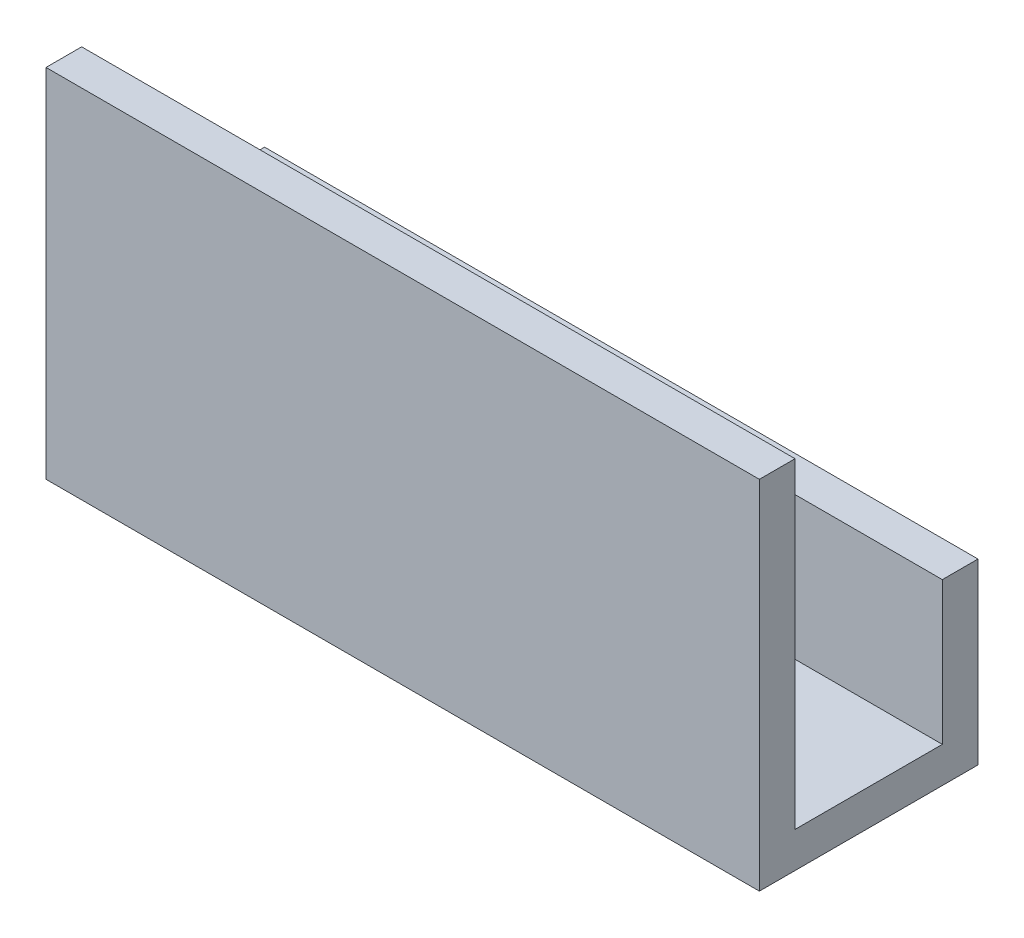
ISO-10303-21;
HEADER;
FILE_DESCRIPTION(('STEP AP214'),'2;1');
FILE_NAME('part.step','',(''),(''),'','','');
FILE_SCHEMA(('AUTOMOTIVE_DESIGN { 1 0 10303 214 1 1 1 1 }'));
ENDSEC;
DATA;
#1=APPLICATION_CONTEXT('core data for automotive mechanical design processes');
#2=APPLICATION_PROTOCOL_DEFINITION('international standard','automotive_design',2000,#1);
#3=PRODUCT_CONTEXT('',#1,'mechanical');
#4=PRODUCT('Part','Part','',(#3));
#5=PRODUCT_RELATED_PRODUCT_CATEGORY('part','',(#4));
#6=PRODUCT_DEFINITION_FORMATION('','',#4);
#7=PRODUCT_DEFINITION_CONTEXT('part definition',#1,'design');
#8=PRODUCT_DEFINITION('design','',#6,#7);
#9=PRODUCT_DEFINITION_SHAPE('','',#8);
#10=(LENGTH_UNIT() NAMED_UNIT(*) SI_UNIT(.MILLI.,.METRE.));
#11=(NAMED_UNIT(*) PLANE_ANGLE_UNIT() SI_UNIT($,.RADIAN.));
#12=(NAMED_UNIT(*) SI_UNIT($,.STERADIAN.) SOLID_ANGLE_UNIT());
#13=UNCERTAINTY_MEASURE_WITH_UNIT(LENGTH_MEASURE(1.E-05),#10,'distance_accuracy_value','');
#14=(GEOMETRIC_REPRESENTATION_CONTEXT(3) GLOBAL_UNCERTAINTY_ASSIGNED_CONTEXT((#13)) GLOBAL_UNIT_ASSIGNED_CONTEXT((#10,
#11,#12)) REPRESENTATION_CONTEXT('',''));
#15=CARTESIAN_POINT('',(0.,0.,0.));
#16=DIRECTION('',(0.,0.,1.));
#17=DIRECTION('',(1.,0.,0.));
#18=AXIS2_PLACEMENT_3D('',#15,#16,#17);
#19=CARTESIAN_POINT('',(25.4,0.,-7.78383));
#20=DIRECTION('',(0.,0.,1.));
#21=DIRECTION('',(1.,0.,0.));
#22=AXIS2_PLACEMENT_3D('',#19,#20,#21);
#23=PLANE('',#22);
#24=DIRECTION('',(0.,1.,0.));
#25=VECTOR('',#24,1.);
#26=CARTESIAN_POINT('',(-25.4,0.,-7.78383));
#27=LINE('',#26,#25);
#28=CARTESIAN_POINT('',(-25.4,0.,-7.78383));
#29=VERTEX_POINT('',#28);
#30=CARTESIAN_POINT('',(-25.4,12.7,-7.78383));
#31=VERTEX_POINT('',#30);
#32=EDGE_CURVE('E133',#29,#31,#27,.T.);
#33=ORIENTED_EDGE('',*,*,#32,.T.);
#34=DIRECTION('',(-1.,0.,0.));
#35=VECTOR('',#34,1.);
#36=CARTESIAN_POINT('',(25.4,12.7,-7.78383));
#37=LINE('',#36,#35);
#38=CARTESIAN_POINT('',(25.4,12.7,-7.78383));
#39=VERTEX_POINT('',#38);
#40=EDGE_CURVE('E11',#39,#31,#37,.T.);
#41=ORIENTED_EDGE('',*,*,#40,.F.);
#42=DIRECTION('',(0.,1.,0.));
#43=VECTOR('',#42,1.);
#44=CARTESIAN_POINT('',(25.4,0.,-7.78383));
#45=LINE('',#44,#43);
#46=CARTESIAN_POINT('',(25.4,0.,-7.78383));
#47=VERTEX_POINT('',#46);
#48=EDGE_CURVE('E147',#47,#39,#45,.T.);
#49=ORIENTED_EDGE('',*,*,#48,.F.);
#50=DIRECTION('',(-1.,0.,0.));
#51=VECTOR('',#50,1.);
#52=CARTESIAN_POINT('',(25.4,0.,-7.78383));
#53=LINE('',#52,#51);
#54=EDGE_CURVE('E129',#47,#29,#53,.T.);
#55=ORIENTED_EDGE('',*,*,#54,.T.);
#56=EDGE_LOOP('',(#33,#41,#49,#55));
#57=FACE_BOUND('',#56,.T.);
#58=ADVANCED_FACE('F37',(#57),#23,.F.);
#59=CARTESIAN_POINT('',(25.4,12.7,-5.24383));
#60=DIRECTION('',(0.,-1.,0.));
#61=DIRECTION('',(0.,0.,-1.));
#62=AXIS2_PLACEMENT_3D('',#59,#60,#61);
#63=PLANE('',#62);
#64=DIRECTION('',(0.,0.,1.));
#65=VECTOR('',#64,1.);
#66=CARTESIAN_POINT('',(-25.4,12.7,-5.24383));
#67=LINE('',#66,#65);
#68=CARTESIAN_POINT('',(-25.4,12.7,-5.24383));
#69=VERTEX_POINT('',#68);
#70=EDGE_CURVE('E136',#31,#69,#67,.T.);
#71=ORIENTED_EDGE('',*,*,#70,.T.);
#72=DIRECTION('',(-1.,0.,0.));
#73=VECTOR('',#72,1.);
#74=CARTESIAN_POINT('',(25.4,12.7,-5.24383));
#75=LINE('',#74,#73);
#76=CARTESIAN_POINT('',(25.4,12.7,-5.24383));
#77=VERTEX_POINT('',#76);
#78=EDGE_CURVE('E45',#77,#69,#75,.T.);
#79=ORIENTED_EDGE('',*,*,#78,.F.);
#80=DIRECTION('',(0.,0.,1.));
#81=VECTOR('',#80,1.);
#82=CARTESIAN_POINT('',(25.4,12.7,-5.24383));
#83=LINE('',#82,#81);
#84=EDGE_CURVE('E96',#39,#77,#83,.T.);
#85=ORIENTED_EDGE('',*,*,#84,.F.);
#86=ORIENTED_EDGE('',*,*,#40,.T.);
#87=EDGE_LOOP('',(#71,#79,#85,#86));
#88=FACE_BOUND('',#87,.T.);
#89=ADVANCED_FACE('F182',(#88),#63,.F.);
#90=CARTESIAN_POINT('',(25.4,2.54,-5.24383));
#91=DIRECTION('',(0.,0.,-1.));
#92=DIRECTION('',(-1.,0.,0.));
#93=AXIS2_PLACEMENT_3D('',#90,#91,#92);
#94=PLANE('',#93);
#95=DIRECTION('',(0.,-1.,0.));
#96=VECTOR('',#95,1.);
#97=CARTESIAN_POINT('',(-25.4,2.54,-5.24383));
#98=LINE('',#97,#96);
#99=CARTESIAN_POINT('',(-25.4,2.54,-5.24383));
#100=VERTEX_POINT('',#99);
#101=EDGE_CURVE('E138',#69,#100,#98,.T.);
#102=ORIENTED_EDGE('',*,*,#101,.T.);
#103=DIRECTION('',(-1.,0.,0.));
#104=VECTOR('',#103,1.);
#105=CARTESIAN_POINT('',(25.4,2.54,-5.24383));
#106=LINE('',#105,#104);
#107=CARTESIAN_POINT('',(25.4,2.54,-5.24383));
#108=VERTEX_POINT('',#107);
#109=EDGE_CURVE('E154',#108,#100,#106,.T.);
#110=ORIENTED_EDGE('',*,*,#109,.F.);
#111=DIRECTION('',(0.,-1.,0.));
#112=VECTOR('',#111,1.);
#113=CARTESIAN_POINT('',(25.4,2.54,-5.24383));
#114=LINE('',#113,#112);
#115=EDGE_CURVE('E162',#77,#108,#114,.T.);
#116=ORIENTED_EDGE('',*,*,#115,.F.);
#117=ORIENTED_EDGE('',*,*,#78,.T.);
#118=EDGE_LOOP('',(#102,#110,#116,#117));
#119=FACE_BOUND('',#118,.T.);
#120=ADVANCED_FACE('F160',(#119),#94,.F.);
#121=CARTESIAN_POINT('',(25.4,2.54,-5.24383));
#122=DIRECTION('',(0.,-1.,0.));
#123=DIRECTION('',(0.,0.,-1.));
#124=AXIS2_PLACEMENT_3D('',#121,#122,#123);
#125=PLANE('',#124);
#126=DIRECTION('',(0.,0.,1.));
#127=VECTOR('',#126,1.);
#128=CARTESIAN_POINT('',(-25.4,2.54,-5.24383));
#129=LINE('',#128,#127);
#130=CARTESIAN_POINT('',(-25.4,2.54,5.24383));
#131=VERTEX_POINT('',#130);
#132=EDGE_CURVE('E140',#100,#131,#129,.T.);
#133=ORIENTED_EDGE('',*,*,#132,.T.);
#134=DIRECTION('',(-1.,0.,0.));
#135=VECTOR('',#134,1.);
#136=CARTESIAN_POINT('',(25.4,2.54,5.24383));
#137=LINE('',#136,#135);
#138=CARTESIAN_POINT('',(25.4,2.54,5.24383));
#139=VERTEX_POINT('',#138);
#140=EDGE_CURVE('E151',#139,#131,#137,.T.);
#141=ORIENTED_EDGE('',*,*,#140,.F.);
#142=DIRECTION('',(0.,0.,1.));
#143=VECTOR('',#142,1.);
#144=CARTESIAN_POINT('',(25.4,2.54,-5.24383));
#145=LINE('',#144,#143);
#146=EDGE_CURVE('E174',#108,#139,#145,.T.);
#147=ORIENTED_EDGE('',*,*,#146,.F.);
#148=ORIENTED_EDGE('',*,*,#109,.T.);
#149=EDGE_LOOP('',(#133,#141,#147,#148));
#150=FACE_BOUND('',#149,.T.);
#151=ADVANCED_FACE('F170',(#150),#125,.F.);
#152=CARTESIAN_POINT('',(25.4,2.54,5.24383));
#153=DIRECTION('',(0.,0.,1.));
#154=DIRECTION('',(1.,0.,0.));
#155=AXIS2_PLACEMENT_3D('',#152,#153,#154);
#156=PLANE('',#155);
#157=DIRECTION('',(0.,1.,0.));
#158=VECTOR('',#157,1.);
#159=CARTESIAN_POINT('',(-25.4,2.54,5.24383));
#160=LINE('',#159,#158);
#161=CARTESIAN_POINT('',(-25.4,25.4,5.24383));
#162=VERTEX_POINT('',#161);
#163=EDGE_CURVE('E142',#131,#162,#160,.T.);
#164=ORIENTED_EDGE('',*,*,#163,.T.);
#165=DIRECTION('',(-1.,0.,0.));
#166=VECTOR('',#165,1.);
#167=CARTESIAN_POINT('',(25.4,25.4,5.24383));
#168=LINE('',#167,#166);
#169=CARTESIAN_POINT('',(25.4,25.4,5.24383));
#170=VERTEX_POINT('',#169);
#171=EDGE_CURVE('E124',#170,#162,#168,.T.);
#172=ORIENTED_EDGE('',*,*,#171,.F.);
#173=DIRECTION('',(0.,1.,0.));
#174=VECTOR('',#173,1.);
#175=CARTESIAN_POINT('',(25.4,2.54,5.24383));
#176=LINE('',#175,#174);
#177=EDGE_CURVE('E115',#139,#170,#176,.T.);
#178=ORIENTED_EDGE('',*,*,#177,.F.);
#179=ORIENTED_EDGE('',*,*,#140,.T.);
#180=EDGE_LOOP('',(#164,#172,#178,#179));
#181=FACE_BOUND('',#180,.T.);
#182=ADVANCED_FACE('F173',(#181),#156,.F.);
#183=CARTESIAN_POINT('',(25.4,25.4,7.78383));
#184=DIRECTION('',(0.,-1.,0.));
#185=DIRECTION('',(0.,0.,-1.));
#186=AXIS2_PLACEMENT_3D('',#183,#184,#185);
#187=PLANE('',#186);
#188=DIRECTION('',(0.,0.,1.));
#189=VECTOR('',#188,1.);
#190=CARTESIAN_POINT('',(-25.4,25.4,7.78383));
#191=LINE('',#190,#189);
#192=CARTESIAN_POINT('',(-25.4,25.4,7.78383));
#193=VERTEX_POINT('',#192);
#194=EDGE_CURVE('E123',#162,#193,#191,.T.);
#195=ORIENTED_EDGE('',*,*,#194,.T.);
#196=DIRECTION('',(-1.,0.,0.));
#197=VECTOR('',#196,1.);
#198=CARTESIAN_POINT('',(25.4,25.4,7.78383));
#199=LINE('',#198,#197);
#200=CARTESIAN_POINT('',(25.4,25.4,7.78383));
#201=VERTEX_POINT('',#200);
#202=EDGE_CURVE('E120',#201,#193,#199,.T.);
#203=ORIENTED_EDGE('',*,*,#202,.F.);
#204=DIRECTION('',(0.,0.,1.));
#205=VECTOR('',#204,1.);
#206=CARTESIAN_POINT('',(25.4,25.4,7.78383));
#207=LINE('',#206,#205);
#208=EDGE_CURVE('E109',#170,#201,#207,.T.);
#209=ORIENTED_EDGE('',*,*,#208,.F.);
#210=ORIENTED_EDGE('',*,*,#171,.T.);
#211=EDGE_LOOP('',(#195,#203,#209,#210));
#212=FACE_BOUND('',#211,.T.);
#213=ADVANCED_FACE('F121',(#212),#187,.F.);
#214=CARTESIAN_POINT('',(25.4,0.,7.78383));
#215=DIRECTION('',(0.,0.,-1.));
#216=DIRECTION('',(-1.,0.,0.));
#217=AXIS2_PLACEMENT_3D('',#214,#215,#216);
#218=PLANE('',#217);
#219=DIRECTION('',(0.,-1.,0.));
#220=VECTOR('',#219,1.);
#221=CARTESIAN_POINT('',(-25.4,0.,7.78383));
#222=LINE('',#221,#220);
#223=CARTESIAN_POINT('',(-25.4,0.,7.78383));
#224=VERTEX_POINT('',#223);
#225=EDGE_CURVE('E82',#193,#224,#222,.T.);
#226=ORIENTED_EDGE('',*,*,#225,.T.);
#227=DIRECTION('',(-1.,0.,0.));
#228=VECTOR('',#227,1.);
#229=CARTESIAN_POINT('',(25.4,0.,7.78383));
#230=LINE('',#229,#228);
#231=CARTESIAN_POINT('',(25.4,0.,7.78383));
#232=VERTEX_POINT('',#231);
#233=EDGE_CURVE('E125',#232,#224,#230,.T.);
#234=ORIENTED_EDGE('',*,*,#233,.F.);
#235=DIRECTION('',(0.,-1.,0.));
#236=VECTOR('',#235,1.);
#237=CARTESIAN_POINT('',(25.4,0.,7.78383));
#238=LINE('',#237,#236);
#239=EDGE_CURVE('E113',#201,#232,#238,.T.);
#240=ORIENTED_EDGE('',*,*,#239,.F.);
#241=ORIENTED_EDGE('',*,*,#202,.T.);
#242=EDGE_LOOP('',(#226,#234,#240,#241));
#243=FACE_BOUND('',#242,.T.);
#244=ADVANCED_FACE('F127',(#243),#218,.F.);
#245=CARTESIAN_POINT('',(25.4,0.,-7.78383));
#246=DIRECTION('',(0.,1.,0.));
#247=DIRECTION('',(0.,0.,1.));
#248=AXIS2_PLACEMENT_3D('',#245,#246,#247);
#249=PLANE('',#248);
#250=DIRECTION('',(0.,0.,-1.));
#251=VECTOR('',#250,1.);
#252=CARTESIAN_POINT('',(-25.4,0.,-7.78383));
#253=LINE('',#252,#251);
#254=EDGE_CURVE('E88',#224,#29,#253,.T.);
#255=ORIENTED_EDGE('',*,*,#254,.T.);
#256=ORIENTED_EDGE('',*,*,#54,.F.);
#257=DIRECTION('',(0.,0.,-1.));
#258=VECTOR('',#257,1.);
#259=CARTESIAN_POINT('',(25.4,0.,-7.78383));
#260=LINE('',#259,#258);
#261=EDGE_CURVE('E53',#232,#47,#260,.T.);
#262=ORIENTED_EDGE('',*,*,#261,.F.);
#263=ORIENTED_EDGE('',*,*,#233,.T.);
#264=EDGE_LOOP('',(#255,#256,#262,#263));
#265=FACE_BOUND('',#264,.T.);
#266=ADVANCED_FACE('F198',(#265),#249,.F.);
#267=CARTESIAN_POINT('',(25.4,0.,0.));
#268=DIRECTION('',(-1.,0.,0.));
#269=DIRECTION('',(0.,0.,1.));
#270=AXIS2_PLACEMENT_3D('',#267,#268,#269);
#271=PLANE('',#270);
#272=ORIENTED_EDGE('',*,*,#48,.T.);
#273=ORIENTED_EDGE('',*,*,#84,.T.);
#274=ORIENTED_EDGE('',*,*,#115,.T.);
#275=ORIENTED_EDGE('',*,*,#146,.T.);
#276=ORIENTED_EDGE('',*,*,#177,.T.);
#277=ORIENTED_EDGE('',*,*,#208,.T.);
#278=ORIENTED_EDGE('',*,*,#239,.T.);
#279=ORIENTED_EDGE('',*,*,#261,.T.);
#280=EDGE_LOOP('',(#272,#273,#274,#275,#276,#277,#278,#279));
#281=FACE_BOUND('',#280,.T.);
#282=ADVANCED_FACE('F111',(#281),#271,.F.);
#283=CARTESIAN_POINT('',(-25.4,0.,0.));
#284=DIRECTION('',(-1.,0.,0.));
#285=DIRECTION('',(0.,0.,1.));
#286=AXIS2_PLACEMENT_3D('',#283,#284,#285);
#287=PLANE('',#286);
#288=ORIENTED_EDGE('',*,*,#32,.F.);
#289=ORIENTED_EDGE('',*,*,#254,.F.);
#290=ORIENTED_EDGE('',*,*,#225,.F.);
#291=ORIENTED_EDGE('',*,*,#194,.F.);
#292=ORIENTED_EDGE('',*,*,#163,.F.);
#293=ORIENTED_EDGE('',*,*,#132,.F.);
#294=ORIENTED_EDGE('',*,*,#101,.F.);
#295=ORIENTED_EDGE('',*,*,#70,.F.);
#296=EDGE_LOOP('',(#288,#289,#290,#291,#292,#293,#294,#295));
#297=FACE_BOUND('',#296,.T.);
#298=ADVANCED_FACE('F166',(#297),#287,.T.);
#299=CLOSED_SHELL('',(#58,#89,#120,#151,#182,#213,#244,#266,#282,#298));
#300=MANIFOLD_SOLID_BREP('B2',#299);
#301=ADVANCED_BREP_SHAPE_REPRESENTATION('',(#18,#300),#14);
#302=SHAPE_DEFINITION_REPRESENTATION(#9,#301);
ENDSEC;
END-ISO-10303-21;
